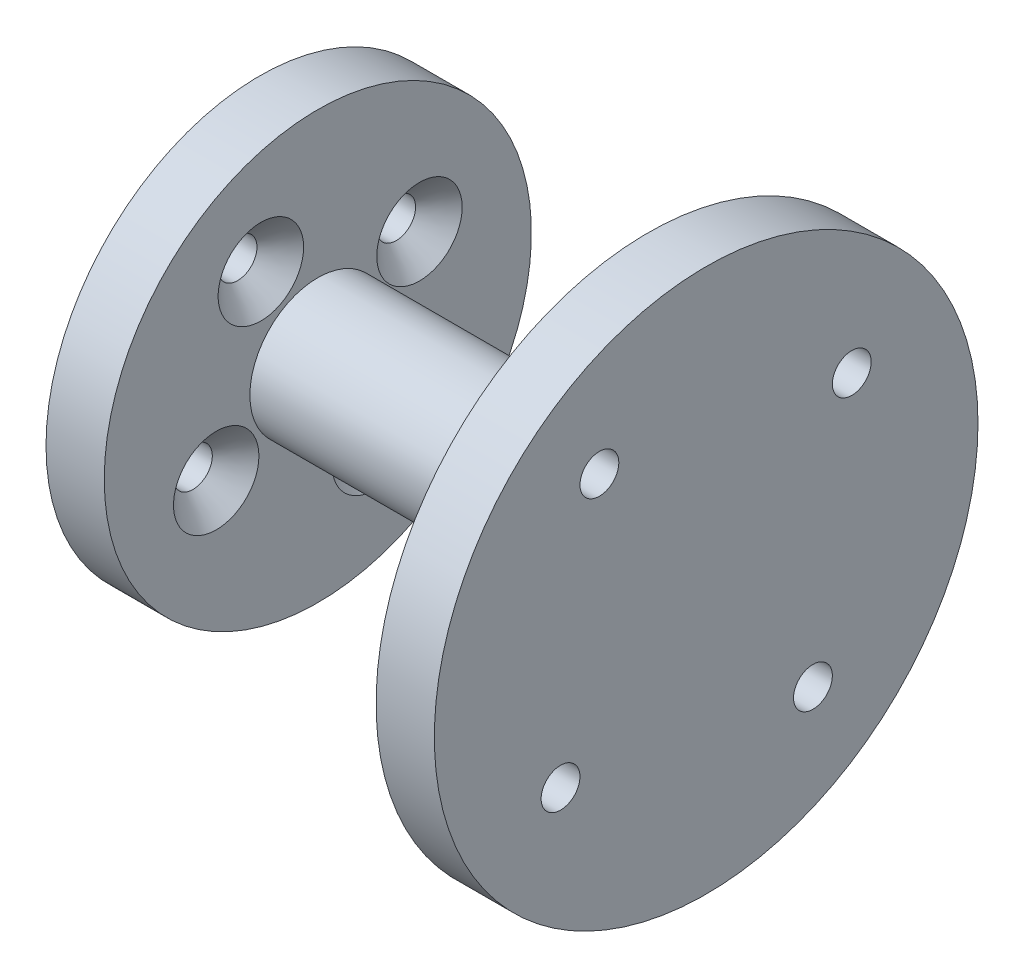
ISO-10303-21;
HEADER;
FILE_DESCRIPTION(('STEP AP214'),'2;1');
FILE_NAME('part.step','',(''),(''),'','','');
FILE_SCHEMA(('AUTOMOTIVE_DESIGN { 1 0 10303 214 1 1 1 1 }'));
ENDSEC;
DATA;
#1=APPLICATION_CONTEXT('core data for automotive mechanical design processes');
#2=APPLICATION_PROTOCOL_DEFINITION('international standard','automotive_design',2000,#1);
#3=PRODUCT_CONTEXT('',#1,'mechanical');
#4=PRODUCT('Part','Part','',(#3));
#5=PRODUCT_RELATED_PRODUCT_CATEGORY('part','',(#4));
#6=PRODUCT_DEFINITION_FORMATION('','',#4);
#7=PRODUCT_DEFINITION_CONTEXT('part definition',#1,'design');
#8=PRODUCT_DEFINITION('design','',#6,#7);
#9=PRODUCT_DEFINITION_SHAPE('','',#8);
#10=(LENGTH_UNIT() NAMED_UNIT(*) SI_UNIT(.MILLI.,.METRE.));
#11=(NAMED_UNIT(*) PLANE_ANGLE_UNIT() SI_UNIT($,.RADIAN.));
#12=(NAMED_UNIT(*) SI_UNIT($,.STERADIAN.) SOLID_ANGLE_UNIT());
#13=UNCERTAINTY_MEASURE_WITH_UNIT(LENGTH_MEASURE(1.E-05),#10,'distance_accuracy_value','');
#14=(GEOMETRIC_REPRESENTATION_CONTEXT(3) GLOBAL_UNCERTAINTY_ASSIGNED_CONTEXT((#13)) GLOBAL_UNIT_ASSIGNED_CONTEXT((#10,
#11,#12)) REPRESENTATION_CONTEXT('',''));
#15=CARTESIAN_POINT('',(0.,0.,0.));
#16=DIRECTION('',(0.,0.,1.));
#17=DIRECTION('',(1.,0.,0.));
#18=AXIS2_PLACEMENT_3D('',#15,#16,#17);
#19=CARTESIAN_POINT('',(4.,11.,0.));
#20=DIRECTION('',(1.,0.,0.));
#21=DIRECTION('',(0.,0.,-1.));
#22=AXIS2_PLACEMENT_3D('',#19,#20,#21);
#23=PLANE('',#22);
#24=CARTESIAN_POINT('',(4.,-2.93338314159258,5.23404846601753));
#25=DIRECTION('',(1.,0.,0.));
#26=DIRECTION('',(0.,0.,-1.));
#27=AXIS2_PLACEMENT_3D('',#24,#25,#26);
#28=CIRCLE('',#27,0.999999999999999);
#29=CARTESIAN_POINT('',(4.,-2.93338314159258,4.23404846601753));
#30=VERTEX_POINT('',#29);
#31=EDGE_CURVE('E76',#30,#30,#28,.T.);
#32=ORIENTED_EDGE('',*,*,#31,.T.);
#33=EDGE_LOOP('',(#32));
#34=FACE_BOUND('',#33,.T.);
#35=CARTESIAN_POINT('',(4.,-5.2340484660175,-2.93338314159263));
#36=DIRECTION('',(1.,0.,0.));
#37=DIRECTION('',(0.,0.,-1.));
#38=AXIS2_PLACEMENT_3D('',#35,#36,#37);
#39=CIRCLE('',#38,0.999999999999998);
#40=CARTESIAN_POINT('',(4.,-5.2340484660175,-3.93338314159263));
#41=VERTEX_POINT('',#40);
#42=EDGE_CURVE('E67',#41,#41,#39,.T.);
#43=ORIENTED_EDGE('',*,*,#42,.T.);
#44=EDGE_LOOP('',(#43));
#45=FACE_BOUND('',#44,.T.);
#46=CARTESIAN_POINT('',(4.,2.93338314159262,-5.23404846601751));
#47=DIRECTION('',(1.,0.,0.));
#48=DIRECTION('',(0.,0.,-1.));
#49=AXIS2_PLACEMENT_3D('',#46,#47,#48);
#50=CIRCLE('',#49,0.999999999999999);
#51=CARTESIAN_POINT('',(4.,2.93338314159262,-6.23404846601751));
#52=VERTEX_POINT('',#51);
#53=EDGE_CURVE('E58',#52,#52,#50,.T.);
#54=ORIENTED_EDGE('',*,*,#53,.T.);
#55=EDGE_LOOP('',(#54));
#56=FACE_BOUND('',#55,.T.);
#57=CARTESIAN_POINT('',(4.,5.2340484660175,2.93338314159263));
#58=DIRECTION('',(1.,0.,0.));
#59=DIRECTION('',(0.,0.,-1.));
#60=AXIS2_PLACEMENT_3D('',#57,#58,#59);
#61=CIRCLE('',#60,0.999999999999998);
#62=CARTESIAN_POINT('',(4.,5.2340484660175,1.93338314159264));
#63=VERTEX_POINT('',#62);
#64=EDGE_CURVE('E47',#63,#63,#61,.T.);
#65=ORIENTED_EDGE('',*,*,#64,.T.);
#66=EDGE_LOOP('',(#65));
#67=FACE_BOUND('',#66,.T.);
#68=CARTESIAN_POINT('',(4.,0.,0.));
#69=DIRECTION('',(-1.,0.,0.));
#70=DIRECTION('',(0.,0.,1.));
#71=AXIS2_PLACEMENT_3D('',#68,#69,#70);
#72=CIRCLE('',#71,11.);
#73=CARTESIAN_POINT('',(4.,0.,11.));
#74=VERTEX_POINT('',#73);
#75=EDGE_CURVE('E43',#74,#74,#72,.T.);
#76=ORIENTED_EDGE('',*,*,#75,.T.);
#77=EDGE_LOOP('',(#76));
#78=FACE_BOUND('',#77,.T.);
#79=ADVANCED_FACE('F33',(#34,#45,#56,#67,#78),#23,.F.);
#80=CARTESIAN_POINT('',(7.,0.,0.));
#81=DIRECTION('',(-1.,0.,0.));
#82=DIRECTION('',(0.,0.,1.));
#83=AXIS2_PLACEMENT_3D('',#80,#81,#82);
#84=PLANE('',#83);
#85=CARTESIAN_POINT('',(7.,0.,0.));
#86=DIRECTION('',(-1.,0.,0.));
#87=DIRECTION('',(0.,0.,1.));
#88=AXIS2_PLACEMENT_3D('',#85,#86,#87);
#89=CIRCLE('',#88,3.5);
#90=CARTESIAN_POINT('',(7.,0.,3.5));
#91=VERTEX_POINT('',#90);
#92=EDGE_CURVE('E10',#91,#91,#89,.F.);
#93=ORIENTED_EDGE('',*,*,#92,.F.);
#94=EDGE_LOOP('',(#93));
#95=FACE_BOUND('',#94,.T.);
#96=CARTESIAN_POINT('',(7.,-2.93338314159258,5.23404846601753));
#97=DIRECTION('',(1.,0.,0.));
#98=DIRECTION('',(0.,0.,-1.));
#99=AXIS2_PLACEMENT_3D('',#96,#97,#98);
#100=CIRCLE('',#99,2.2);
#101=CARTESIAN_POINT('',(7.,-2.93338314159258,3.03404846601753));
#102=VERTEX_POINT('',#101);
#103=EDGE_CURVE('E82',#102,#102,#100,.T.);
#104=ORIENTED_EDGE('',*,*,#103,.F.);
#105=EDGE_LOOP('',(#104));
#106=FACE_BOUND('',#105,.T.);
#107=CARTESIAN_POINT('',(7.,-5.2340484660175,-2.93338314159263));
#108=DIRECTION('',(1.,0.,0.));
#109=DIRECTION('',(0.,0.,-1.));
#110=AXIS2_PLACEMENT_3D('',#107,#108,#109);
#111=CIRCLE('',#110,2.2);
#112=CARTESIAN_POINT('',(7.,-5.2340484660175,-5.13338314159263));
#113=VERTEX_POINT('',#112);
#114=EDGE_CURVE('E73',#113,#113,#111,.T.);
#115=ORIENTED_EDGE('',*,*,#114,.F.);
#116=EDGE_LOOP('',(#115));
#117=FACE_BOUND('',#116,.T.);
#118=CARTESIAN_POINT('',(7.,2.93338314159262,-5.23404846601751));
#119=DIRECTION('',(1.,0.,0.));
#120=DIRECTION('',(0.,0.,-1.));
#121=AXIS2_PLACEMENT_3D('',#118,#119,#120);
#122=CIRCLE('',#121,2.2);
#123=CARTESIAN_POINT('',(7.,2.93338314159262,-7.43404846601751));
#124=VERTEX_POINT('',#123);
#125=EDGE_CURVE('E64',#124,#124,#122,.T.);
#126=ORIENTED_EDGE('',*,*,#125,.F.);
#127=EDGE_LOOP('',(#126));
#128=FACE_BOUND('',#127,.T.);
#129=CARTESIAN_POINT('',(7.,5.2340484660175,2.93338314159263));
#130=DIRECTION('',(1.,0.,0.));
#131=DIRECTION('',(0.,0.,-1.));
#132=AXIS2_PLACEMENT_3D('',#129,#130,#131);
#133=CIRCLE('',#132,2.2);
#134=CARTESIAN_POINT('',(7.,5.2340484660175,0.733383141592633));
#135=VERTEX_POINT('',#134);
#136=EDGE_CURVE('E55',#135,#135,#133,.T.);
#137=ORIENTED_EDGE('',*,*,#136,.F.);
#138=EDGE_LOOP('',(#137));
#139=FACE_BOUND('',#138,.T.);
#140=CARTESIAN_POINT('',(7.,0.,0.));
#141=DIRECTION('',(-1.,0.,0.));
#142=DIRECTION('',(0.,0.,1.));
#143=AXIS2_PLACEMENT_3D('',#140,#141,#142);
#144=CIRCLE('',#143,11.);
#145=CARTESIAN_POINT('',(7.,0.,11.));
#146=VERTEX_POINT('',#145);
#147=EDGE_CURVE('E39',#146,#146,#144,.T.);
#148=ORIENTED_EDGE('',*,*,#147,.F.);
#149=EDGE_LOOP('',(#148));
#150=FACE_BOUND('',#149,.T.);
#151=ADVANCED_FACE('F153',(#95,#106,#117,#128,#139,#150),#84,.F.);
#152=CARTESIAN_POINT('',(0.,0.,0.));
#153=DIRECTION('',(-1.,0.,0.));
#154=DIRECTION('',(0.,0.,1.));
#155=AXIS2_PLACEMENT_3D('',#152,#153,#154);
#156=CYLINDRICAL_SURFACE('',#155,11.);
#157=ORIENTED_EDGE('',*,*,#75,.F.);
#158=EDGE_LOOP('',(#157));
#159=FACE_BOUND('',#158,.T.);
#160=ORIENTED_EDGE('',*,*,#147,.T.);
#161=EDGE_LOOP('',(#160));
#162=FACE_BOUND('',#161,.T.);
#163=ADVANCED_FACE('F158',(#159,#162),#156,.T.);
#164=CARTESIAN_POINT('',(7.,5.2340484660175,2.93338314159263));
#165=DIRECTION('',(1.,0.,0.));
#166=DIRECTION('',(0.,0.,-1.));
#167=AXIS2_PLACEMENT_3D('',#164,#165,#166);
#168=CYLINDRICAL_SURFACE('',#167,0.999999999999998);
#169=ORIENTED_EDGE('',*,*,#64,.F.);
#170=EDGE_LOOP('',(#169));
#171=FACE_BOUND('',#170,.T.);
#172=CARTESIAN_POINT('',(5.8,5.2340484660175,2.93338314159263));
#173=DIRECTION('',(1.,0.,0.));
#174=DIRECTION('',(0.,0.,-1.));
#175=AXIS2_PLACEMENT_3D('',#172,#173,#174);
#176=CIRCLE('',#175,0.999999999999998);
#177=CARTESIAN_POINT('',(5.8,5.2340484660175,1.93338314159264));
#178=VERTEX_POINT('',#177);
#179=EDGE_CURVE('E52',#178,#178,#176,.T.);
#180=ORIENTED_EDGE('',*,*,#179,.T.);
#181=EDGE_LOOP('',(#180));
#182=FACE_BOUND('',#181,.T.);
#183=ADVANCED_FACE('F171',(#171,#182),#168,.F.);
#184=CARTESIAN_POINT('',(7.,5.2340484660175,2.93338314159263));
#185=DIRECTION('',(1.,0.,0.));
#186=DIRECTION('',(0.,0.,-1.));
#187=AXIS2_PLACEMENT_3D('',#184,#185,#186);
#188=CONICAL_SURFACE('',#187,2.2,0.785398163397448);
#189=ORIENTED_EDGE('',*,*,#179,.F.);
#190=EDGE_LOOP('',(#189));
#191=FACE_BOUND('',#190,.T.);
#192=ORIENTED_EDGE('',*,*,#136,.T.);
#193=EDGE_LOOP('',(#192));
#194=FACE_BOUND('',#193,.T.);
#195=ADVANCED_FACE('F176',(#191,#194),#188,.F.);
#196=CARTESIAN_POINT('',(7.,2.93338314159262,-5.23404846601751));
#197=DIRECTION('',(1.,0.,0.));
#198=DIRECTION('',(0.,0.,-1.));
#199=AXIS2_PLACEMENT_3D('',#196,#197,#198);
#200=CYLINDRICAL_SURFACE('',#199,0.999999999999999);
#201=ORIENTED_EDGE('',*,*,#53,.F.);
#202=EDGE_LOOP('',(#201));
#203=FACE_BOUND('',#202,.T.);
#204=CARTESIAN_POINT('',(5.8,2.93338314159262,-5.23404846601751));
#205=DIRECTION('',(1.,0.,0.));
#206=DIRECTION('',(0.,0.,-1.));
#207=AXIS2_PLACEMENT_3D('',#204,#205,#206);
#208=CIRCLE('',#207,0.999999999999998);
#209=CARTESIAN_POINT('',(5.8,2.93338314159262,-6.23404846601751));
#210=VERTEX_POINT('',#209);
#211=EDGE_CURVE('E61',#210,#210,#208,.T.);
#212=ORIENTED_EDGE('',*,*,#211,.T.);
#213=EDGE_LOOP('',(#212));
#214=FACE_BOUND('',#213,.T.);
#215=ADVANCED_FACE('F182',(#203,#214),#200,.F.);
#216=CARTESIAN_POINT('',(7.,2.93338314159262,-5.23404846601751));
#217=DIRECTION('',(1.,0.,0.));
#218=DIRECTION('',(0.,0.,-1.));
#219=AXIS2_PLACEMENT_3D('',#216,#217,#218);
#220=CONICAL_SURFACE('',#219,2.2,0.785398163397448);
#221=ORIENTED_EDGE('',*,*,#211,.F.);
#222=EDGE_LOOP('',(#221));
#223=FACE_BOUND('',#222,.T.);
#224=ORIENTED_EDGE('',*,*,#125,.T.);
#225=EDGE_LOOP('',(#224));
#226=FACE_BOUND('',#225,.T.);
#227=ADVANCED_FACE('F186',(#223,#226),#220,.F.);
#228=CARTESIAN_POINT('',(7.,-5.2340484660175,-2.93338314159263));
#229=DIRECTION('',(1.,0.,0.));
#230=DIRECTION('',(0.,0.,-1.));
#231=AXIS2_PLACEMENT_3D('',#228,#229,#230);
#232=CYLINDRICAL_SURFACE('',#231,0.999999999999998);
#233=ORIENTED_EDGE('',*,*,#42,.F.);
#234=EDGE_LOOP('',(#233));
#235=FACE_BOUND('',#234,.T.);
#236=CARTESIAN_POINT('',(5.8,-5.2340484660175,-2.93338314159263));
#237=DIRECTION('',(1.,0.,0.));
#238=DIRECTION('',(0.,0.,-1.));
#239=AXIS2_PLACEMENT_3D('',#236,#237,#238);
#240=CIRCLE('',#239,0.999999999999998);
#241=CARTESIAN_POINT('',(5.8,-5.2340484660175,-3.93338314159263));
#242=VERTEX_POINT('',#241);
#243=EDGE_CURVE('E70',#242,#242,#240,.T.);
#244=ORIENTED_EDGE('',*,*,#243,.T.);
#245=EDGE_LOOP('',(#244));
#246=FACE_BOUND('',#245,.T.);
#247=ADVANCED_FACE('F190',(#235,#246),#232,.F.);
#248=CARTESIAN_POINT('',(7.,-5.2340484660175,-2.93338314159263));
#249=DIRECTION('',(1.,0.,0.));
#250=DIRECTION('',(0.,0.,-1.));
#251=AXIS2_PLACEMENT_3D('',#248,#249,#250);
#252=CONICAL_SURFACE('',#251,2.2,0.785398163397448);
#253=ORIENTED_EDGE('',*,*,#243,.F.);
#254=EDGE_LOOP('',(#253));
#255=FACE_BOUND('',#254,.T.);
#256=ORIENTED_EDGE('',*,*,#114,.T.);
#257=EDGE_LOOP('',(#256));
#258=FACE_BOUND('',#257,.T.);
#259=ADVANCED_FACE('F194',(#255,#258),#252,.F.);
#260=CARTESIAN_POINT('',(7.,-2.93338314159258,5.23404846601753));
#261=DIRECTION('',(1.,0.,0.));
#262=DIRECTION('',(0.,0.,-1.));
#263=AXIS2_PLACEMENT_3D('',#260,#261,#262);
#264=CYLINDRICAL_SURFACE('',#263,0.999999999999999);
#265=ORIENTED_EDGE('',*,*,#31,.F.);
#266=EDGE_LOOP('',(#265));
#267=FACE_BOUND('',#266,.T.);
#268=CARTESIAN_POINT('',(5.8,-2.93338314159258,5.23404846601753));
#269=DIRECTION('',(1.,0.,0.));
#270=DIRECTION('',(0.,0.,-1.));
#271=AXIS2_PLACEMENT_3D('',#268,#269,#270);
#272=CIRCLE('',#271,0.999999999999999);
#273=CARTESIAN_POINT('',(5.8,-2.93338314159258,4.23404846601753));
#274=VERTEX_POINT('',#273);
#275=EDGE_CURVE('E79',#274,#274,#272,.T.);
#276=ORIENTED_EDGE('',*,*,#275,.T.);
#277=EDGE_LOOP('',(#276));
#278=FACE_BOUND('',#277,.T.);
#279=ADVANCED_FACE('F198',(#267,#278),#264,.F.);
#280=CARTESIAN_POINT('',(7.,-2.93338314159258,5.23404846601753));
#281=DIRECTION('',(1.,0.,0.));
#282=DIRECTION('',(0.,0.,-1.));
#283=AXIS2_PLACEMENT_3D('',#280,#281,#282);
#284=CONICAL_SURFACE('',#283,2.2,0.785398163397448);
#285=ORIENTED_EDGE('',*,*,#275,.F.);
#286=EDGE_LOOP('',(#285));
#287=FACE_BOUND('',#286,.T.);
#288=ORIENTED_EDGE('',*,*,#103,.T.);
#289=EDGE_LOOP('',(#288));
#290=FACE_BOUND('',#289,.T.);
#291=ADVANCED_FACE('F148',(#287,#290),#284,.F.);
#292=CARTESIAN_POINT('',(24.,0.,0.));
#293=DIRECTION('',(-1.,0.,0.));
#294=DIRECTION('',(0.,0.,1.));
#295=AXIS2_PLACEMENT_3D('',#292,#293,#294);
#296=CYLINDRICAL_SURFACE('',#295,3.5);
#297=CARTESIAN_POINT('',(24.,0.,0.));
#298=DIRECTION('',(1.,0.,0.));
#299=DIRECTION('',(0.,0.,-1.));
#300=AXIS2_PLACEMENT_3D('',#297,#298,#299);
#301=CIRCLE('',#300,3.5);
#302=CARTESIAN_POINT('',(24.,0.,-3.5));
#303=VERTEX_POINT('',#302);
#304=EDGE_CURVE('E85',#303,#303,#301,.T.);
#305=ORIENTED_EDGE('',*,*,#304,.F.);
#306=EDGE_LOOP('',(#305));
#307=FACE_BOUND('',#306,.T.);
#308=ORIENTED_EDGE('',*,*,#92,.T.);
#309=EDGE_LOOP('',(#308));
#310=FACE_BOUND('',#309,.T.);
#311=ADVANCED_FACE('F139',(#307,#310),#296,.T.);
#312=CARTESIAN_POINT('',(27.,0.,0.));
#313=DIRECTION('',(-1.,0.,0.));
#314=DIRECTION('',(0.,0.,1.));
#315=AXIS2_PLACEMENT_3D('',#312,#313,#314);
#316=CYLINDRICAL_SURFACE('',#315,14.);
#317=CARTESIAN_POINT('',(27.,0.,0.));
#318=DIRECTION('',(1.,0.,0.));
#319=DIRECTION('',(0.,0.,-1.));
#320=AXIS2_PLACEMENT_3D('',#317,#318,#319);
#321=CIRCLE('',#320,14.);
#322=CARTESIAN_POINT('',(27.,0.,-14.));
#323=VERTEX_POINT('',#322);
#324=EDGE_CURVE('E88',#323,#323,#321,.T.);
#325=ORIENTED_EDGE('',*,*,#324,.F.);
#326=EDGE_LOOP('',(#325));
#327=FACE_BOUND('',#326,.T.);
#328=CARTESIAN_POINT('',(24.,0.,0.));
#329=DIRECTION('',(1.,0.,0.));
#330=DIRECTION('',(0.,0.,-1.));
#331=AXIS2_PLACEMENT_3D('',#328,#329,#330);
#332=CIRCLE('',#331,14.);
#333=CARTESIAN_POINT('',(24.,0.,-14.));
#334=VERTEX_POINT('',#333);
#335=EDGE_CURVE('E89',#334,#334,#332,.T.);
#336=ORIENTED_EDGE('',*,*,#335,.T.);
#337=EDGE_LOOP('',(#336));
#338=FACE_BOUND('',#337,.T.);
#339=ADVANCED_FACE('F137',(#327,#338),#316,.T.);
#340=CARTESIAN_POINT('',(27.,0.,0.));
#341=DIRECTION('',(1.,0.,0.));
#342=DIRECTION('',(0.,0.,-1.));
#343=AXIS2_PLACEMENT_3D('',#340,#341,#342);
#344=PLANE('',#343);
#345=CARTESIAN_POINT('',(27.,5.49909083394698,-7.50000000000002));
#346=DIRECTION('',(1.,0.,0.));
#347=DIRECTION('',(0.,-1.,0.));
#348=AXIS2_PLACEMENT_3D('',#345,#346,#347);
#349=CIRCLE('',#348,1.);
#350=CARTESIAN_POINT('',(27.,4.49909083394698,-7.50000000000002));
#351=VERTEX_POINT('',#350);
#352=EDGE_CURVE('E100',#351,#351,#349,.T.);
#353=ORIENTED_EDGE('',*,*,#352,.F.);
#354=EDGE_LOOP('',(#353));
#355=FACE_BOUND('',#354,.T.);
#356=CARTESIAN_POINT('',(27.,-7.5,-5.49909083394701));
#357=DIRECTION('',(1.,0.,0.));
#358=DIRECTION('',(0.,0.,1.));
#359=AXIS2_PLACEMENT_3D('',#356,#357,#358);
#360=CIRCLE('',#359,1.);
#361=CARTESIAN_POINT('',(27.,-7.5,-4.49909083394701));
#362=VERTEX_POINT('',#361);
#363=EDGE_CURVE('E108',#362,#362,#360,.T.);
#364=ORIENTED_EDGE('',*,*,#363,.F.);
#365=EDGE_LOOP('',(#364));
#366=FACE_BOUND('',#365,.T.);
#367=CARTESIAN_POINT('',(27.,-5.49909083394693,7.50000000000006));
#368=DIRECTION('',(1.,0.,0.));
#369=DIRECTION('',(0.,1.,0.));
#370=AXIS2_PLACEMENT_3D('',#367,#368,#369);
#371=CIRCLE('',#370,1.);
#372=CARTESIAN_POINT('',(27.,-4.49909083394693,7.50000000000005));
#373=VERTEX_POINT('',#372);
#374=EDGE_CURVE('E101',#373,#373,#371,.T.);
#375=ORIENTED_EDGE('',*,*,#374,.F.);
#376=EDGE_LOOP('',(#375));
#377=FACE_BOUND('',#376,.T.);
#378=CARTESIAN_POINT('',(27.,7.5,5.49909083394701));
#379=DIRECTION('',(1.,0.,0.));
#380=DIRECTION('',(0.,0.,-1.));
#381=AXIS2_PLACEMENT_3D('',#378,#379,#380);
#382=CIRCLE('',#381,1.);
#383=CARTESIAN_POINT('',(27.,7.5,4.49909083394701));
#384=VERTEX_POINT('',#383);
#385=EDGE_CURVE('E92',#384,#384,#382,.T.);
#386=ORIENTED_EDGE('',*,*,#385,.F.);
#387=EDGE_LOOP('',(#386));
#388=FACE_BOUND('',#387,.T.);
#389=ORIENTED_EDGE('',*,*,#324,.T.);
#390=EDGE_LOOP('',(#389));
#391=FACE_BOUND('',#390,.T.);
#392=ADVANCED_FACE('F125',(#355,#366,#377,#388,#391),#344,.T.);
#393=CARTESIAN_POINT('',(24.,0.,0.));
#394=DIRECTION('',(1.,0.,0.));
#395=DIRECTION('',(0.,0.,-1.));
#396=AXIS2_PLACEMENT_3D('',#393,#394,#395);
#397=PLANE('',#396);
#398=CARTESIAN_POINT('',(24.,5.49909083394698,-7.50000000000002));
#399=DIRECTION('',(1.,0.,0.));
#400=DIRECTION('',(0.,0.,-1.));
#401=AXIS2_PLACEMENT_3D('',#398,#399,#400);
#402=CIRCLE('',#401,1.);
#403=CARTESIAN_POINT('',(24.,5.49909083394698,-8.50000000000002));
#404=VERTEX_POINT('',#403);
#405=EDGE_CURVE('E111',#404,#404,#402,.F.);
#406=ORIENTED_EDGE('',*,*,#405,.F.);
#407=EDGE_LOOP('',(#406));
#408=FACE_BOUND('',#407,.T.);
#409=CARTESIAN_POINT('',(24.,-7.5,-5.49909083394701));
#410=DIRECTION('',(1.,0.,0.));
#411=DIRECTION('',(0.,0.,-1.));
#412=AXIS2_PLACEMENT_3D('',#409,#410,#411);
#413=CIRCLE('',#412,1.);
#414=CARTESIAN_POINT('',(24.,-7.5,-6.49909083394701));
#415=VERTEX_POINT('',#414);
#416=EDGE_CURVE('E104',#415,#415,#413,.F.);
#417=ORIENTED_EDGE('',*,*,#416,.F.);
#418=EDGE_LOOP('',(#417));
#419=FACE_BOUND('',#418,.T.);
#420=CARTESIAN_POINT('',(24.,-5.49909083394693,7.50000000000006));
#421=DIRECTION('',(1.,0.,0.));
#422=DIRECTION('',(0.,0.,-1.));
#423=AXIS2_PLACEMENT_3D('',#420,#421,#422);
#424=CIRCLE('',#423,1.);
#425=CARTESIAN_POINT('',(24.,-5.49909083394693,6.50000000000006));
#426=VERTEX_POINT('',#425);
#427=EDGE_CURVE('E105',#426,#426,#424,.F.);
#428=ORIENTED_EDGE('',*,*,#427,.F.);
#429=EDGE_LOOP('',(#428));
#430=FACE_BOUND('',#429,.T.);
#431=CARTESIAN_POINT('',(24.,7.5,5.49909083394701));
#432=DIRECTION('',(1.,0.,0.));
#433=DIRECTION('',(0.,0.,-1.));
#434=AXIS2_PLACEMENT_3D('',#431,#432,#433);
#435=CIRCLE('',#434,1.);
#436=CARTESIAN_POINT('',(24.,7.5,4.49909083394701));
#437=VERTEX_POINT('',#436);
#438=EDGE_CURVE('E97',#437,#437,#435,.F.);
#439=ORIENTED_EDGE('',*,*,#438,.F.);
#440=EDGE_LOOP('',(#439));
#441=FACE_BOUND('',#440,.T.);
#442=ORIENTED_EDGE('',*,*,#304,.T.);
#443=EDGE_LOOP('',(#442));
#444=FACE_BOUND('',#443,.T.);
#445=ORIENTED_EDGE('',*,*,#335,.F.);
#446=EDGE_LOOP('',(#445));
#447=FACE_BOUND('',#446,.T.);
#448=ADVANCED_FACE('F121',(#408,#419,#430,#441,#444,#447),#397,.F.);
#449=CARTESIAN_POINT('',(3.999,7.5,5.49909083394701));
#450=DIRECTION('',(1.,0.,0.));
#451=DIRECTION('',(0.,0.,-1.));
#452=AXIS2_PLACEMENT_3D('',#449,#450,#451);
#453=CYLINDRICAL_SURFACE('',#452,1.);
#454=ORIENTED_EDGE('',*,*,#385,.T.);
#455=EDGE_LOOP('',(#454));
#456=FACE_BOUND('',#455,.T.);
#457=ORIENTED_EDGE('',*,*,#438,.T.);
#458=EDGE_LOOP('',(#457));
#459=FACE_BOUND('',#458,.T.);
#460=ADVANCED_FACE('F124',(#456,#459),#453,.F.);
#461=CARTESIAN_POINT('',(3.999,-5.49909083394693,7.50000000000006));
#462=DIRECTION('',(1.,0.,0.));
#463=DIRECTION('',(0.,0.,-1.));
#464=AXIS2_PLACEMENT_3D('',#461,#462,#463);
#465=CYLINDRICAL_SURFACE('',#464,1.);
#466=ORIENTED_EDGE('',*,*,#374,.T.);
#467=EDGE_LOOP('',(#466));
#468=FACE_BOUND('',#467,.T.);
#469=ORIENTED_EDGE('',*,*,#427,.T.);
#470=EDGE_LOOP('',(#469));
#471=FACE_BOUND('',#470,.T.);
#472=ADVANCED_FACE('F245',(#468,#471),#465,.F.);
#473=CARTESIAN_POINT('',(3.999,-7.5,-5.49909083394701));
#474=DIRECTION('',(1.,0.,0.));
#475=DIRECTION('',(0.,0.,-1.));
#476=AXIS2_PLACEMENT_3D('',#473,#474,#475);
#477=CYLINDRICAL_SURFACE('',#476,1.);
#478=ORIENTED_EDGE('',*,*,#363,.T.);
#479=EDGE_LOOP('',(#478));
#480=FACE_BOUND('',#479,.T.);
#481=ORIENTED_EDGE('',*,*,#416,.T.);
#482=EDGE_LOOP('',(#481));
#483=FACE_BOUND('',#482,.T.);
#484=ADVANCED_FACE('F266',(#480,#483),#477,.F.);
#485=CARTESIAN_POINT('',(3.999,5.49909083394698,-7.50000000000002));
#486=DIRECTION('',(1.,0.,0.));
#487=DIRECTION('',(0.,0.,-1.));
#488=AXIS2_PLACEMENT_3D('',#485,#486,#487);
#489=CYLINDRICAL_SURFACE('',#488,1.);
#490=ORIENTED_EDGE('',*,*,#352,.T.);
#491=EDGE_LOOP('',(#490));
#492=FACE_BOUND('',#491,.T.);
#493=ORIENTED_EDGE('',*,*,#405,.T.);
#494=EDGE_LOOP('',(#493));
#495=FACE_BOUND('',#494,.T.);
#496=ADVANCED_FACE('F119',(#492,#495),#489,.F.);
#497=CLOSED_SHELL('',(#79,#151,#163,#183,#195,#215,#227,#247,#259,#279,#291,#311,#339,#392,#448,
#460,#472,#484,#496));
#498=MANIFOLD_SOLID_BREP('B2',#497);
#499=ADVANCED_BREP_SHAPE_REPRESENTATION('',(#18,#498),#14);
#500=SHAPE_DEFINITION_REPRESENTATION(#9,#499);
ENDSEC;
END-ISO-10303-21;
